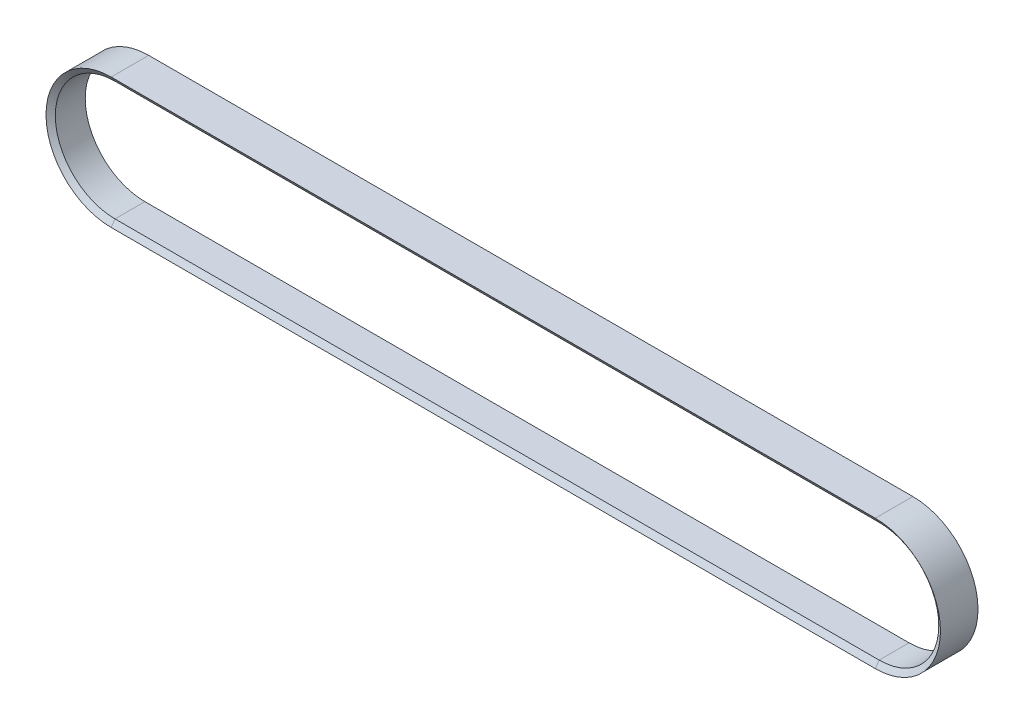
ISO-10303-21;
HEADER;
FILE_DESCRIPTION(('STEP AP214'),'2;1');
FILE_NAME('part.step','',(''),(''),'','','');
FILE_SCHEMA(('AUTOMOTIVE_DESIGN { 1 0 10303 214 1 1 1 1 }'));
ENDSEC;
DATA;
#1=APPLICATION_CONTEXT('core data for automotive mechanical design processes');
#2=APPLICATION_PROTOCOL_DEFINITION('international standard','automotive_design',2000,#1);
#3=PRODUCT_CONTEXT('',#1,'mechanical');
#4=PRODUCT('Part','Part','',(#3));
#5=PRODUCT_RELATED_PRODUCT_CATEGORY('part','',(#4));
#6=PRODUCT_DEFINITION_FORMATION('','',#4);
#7=PRODUCT_DEFINITION_CONTEXT('part definition',#1,'design');
#8=PRODUCT_DEFINITION('design','',#6,#7);
#9=PRODUCT_DEFINITION_SHAPE('','',#8);
#10=(LENGTH_UNIT() NAMED_UNIT(*) SI_UNIT(.MILLI.,.METRE.));
#11=(NAMED_UNIT(*) PLANE_ANGLE_UNIT() SI_UNIT($,.RADIAN.));
#12=(NAMED_UNIT(*) SI_UNIT($,.STERADIAN.) SOLID_ANGLE_UNIT());
#13=UNCERTAINTY_MEASURE_WITH_UNIT(LENGTH_MEASURE(1.E-05),#10,'distance_accuracy_value','');
#14=(GEOMETRIC_REPRESENTATION_CONTEXT(3) GLOBAL_UNCERTAINTY_ASSIGNED_CONTEXT((#13)) GLOBAL_UNIT_ASSIGNED_CONTEXT((#10,
#11,#12)) REPRESENTATION_CONTEXT('',''));
#15=CARTESIAN_POINT('',(0.,0.,0.));
#16=DIRECTION('',(0.,0.,1.));
#17=DIRECTION('',(1.,0.,0.));
#18=AXIS2_PLACEMENT_3D('',#15,#16,#17);
#19=CARTESIAN_POINT('',(0.,0.,0.));
#20=DIRECTION('',(0.,0.,-1.));
#21=DIRECTION('',(-1.,0.,0.));
#22=AXIS2_PLACEMENT_3D('',#19,#20,#21);
#23=CYLINDRICAL_SURFACE('',#22,54.);
#24=CARTESIAN_POINT('',(0.,0.,13.535));
#25=DIRECTION('',(0.,0.,-1.));
#26=DIRECTION('',(0.,-1.,0.));
#27=AXIS2_PLACEMENT_3D('',#24,#25,#26);
#28=CIRCLE('',#27,54.);
#29=CARTESIAN_POINT('',(0.,-54.,13.535));
#30=VERTEX_POINT('',#29);
#31=CARTESIAN_POINT('',(0.,54.,13.535));
#32=VERTEX_POINT('',#31);
#33=EDGE_CURVE('E11',#30,#32,#28,.T.);
#34=ORIENTED_EDGE('',*,*,#33,.F.);
#35=DIRECTION('',(0.,0.,-1.));
#36=VECTOR('',#35,1.);
#37=CARTESIAN_POINT('',(0.,-54.,13.535));
#38=LINE('',#37,#36);
#39=CARTESIAN_POINT('',(0.,-54.,-13.535));
#40=VERTEX_POINT('',#39);
#41=EDGE_CURVE('E40',#30,#40,#38,.T.);
#42=ORIENTED_EDGE('',*,*,#41,.T.);
#43=CARTESIAN_POINT('',(0.,0.,-13.535));
#44=DIRECTION('',(0.,0.,-1.));
#45=DIRECTION('',(0.,-1.,0.));
#46=AXIS2_PLACEMENT_3D('',#43,#44,#45);
#47=CIRCLE('',#46,54.);
#48=CARTESIAN_POINT('',(0.,54.,-13.535));
#49=VERTEX_POINT('',#48);
#50=EDGE_CURVE('E125',#40,#49,#47,.T.);
#51=ORIENTED_EDGE('',*,*,#50,.T.);
#52=DIRECTION('',(0.,0.,-1.));
#53=VECTOR('',#52,1.);
#54=CARTESIAN_POINT('',(0.,54.,13.535));
#55=LINE('',#54,#53);
#56=EDGE_CURVE('E128',#32,#49,#55,.T.);
#57=ORIENTED_EDGE('',*,*,#56,.F.);
#58=EDGE_LOOP('',(#34,#42,#51,#57));
#59=FACE_BOUND('',#58,.T.);
#60=ADVANCED_FACE('F37',(#59),#23,.F.);
#61=CARTESIAN_POINT('',(0.,0.,17.));
#62=DIRECTION('',(0.,0.,1.));
#63=DIRECTION('',(1.,0.,0.));
#64=AXIS2_PLACEMENT_3D('',#61,#62,#63);
#65=CONICAL_SURFACE('',#64,59.,0.964783814806948);
#66=CARTESIAN_POINT('',(0.,0.,17.));
#67=DIRECTION('',(0.,0.,-1.));
#68=DIRECTION('',(0.,-1.,0.));
#69=AXIS2_PLACEMENT_3D('',#66,#67,#68);
#70=CIRCLE('',#69,59.);
#71=CARTESIAN_POINT('',(0.,-59.,17.));
#72=VERTEX_POINT('',#71);
#73=CARTESIAN_POINT('',(0.,59.,17.));
#74=VERTEX_POINT('',#73);
#75=EDGE_CURVE('E45',#72,#74,#70,.T.);
#76=ORIENTED_EDGE('',*,*,#75,.F.);
#77=DIRECTION('',(0.,0.821925797703744,-0.569594577808695));
#78=VECTOR('',#77,1.);
#79=CARTESIAN_POINT('',(0.,-54.,13.535));
#80=LINE('',#79,#78);
#81=EDGE_CURVE('E195',#72,#30,#80,.T.);
#82=ORIENTED_EDGE('',*,*,#81,.T.);
#83=ORIENTED_EDGE('',*,*,#33,.T.);
#84=DIRECTION('',(0.,-0.821925797703744,-0.569594577808695));
#85=VECTOR('',#84,1.);
#86=CARTESIAN_POINT('',(0.,54.,13.535));
#87=LINE('',#86,#85);
#88=EDGE_CURVE('E153',#74,#32,#87,.T.);
#89=ORIENTED_EDGE('',*,*,#88,.F.);
#90=EDGE_LOOP('',(#76,#82,#83,#89));
#91=FACE_BOUND('',#90,.T.);
#92=ADVANCED_FACE('F219',(#91),#65,.F.);
#93=CARTESIAN_POINT('',(0.,0.,0.));
#94=DIRECTION('',(0.,0.,-1.));
#95=DIRECTION('',(-1.,0.,0.));
#96=AXIS2_PLACEMENT_3D('',#93,#94,#95);
#97=CYLINDRICAL_SURFACE('',#96,59.);
#98=CARTESIAN_POINT('',(0.,0.,-17.));
#99=DIRECTION('',(0.,0.,-1.));
#100=DIRECTION('',(0.,-1.,0.));
#101=AXIS2_PLACEMENT_3D('',#98,#99,#100);
#102=CIRCLE('',#101,59.);
#103=CARTESIAN_POINT('',(0.,-59.,-17.));
#104=VERTEX_POINT('',#103);
#105=CARTESIAN_POINT('',(0.,59.,-17.));
#106=VERTEX_POINT('',#105);
#107=EDGE_CURVE('E134',#104,#106,#102,.T.);
#108=ORIENTED_EDGE('',*,*,#107,.F.);
#109=DIRECTION('',(0.,0.,1.));
#110=VECTOR('',#109,1.);
#111=CARTESIAN_POINT('',(0.,-59.,-17.));
#112=LINE('',#111,#110);
#113=EDGE_CURVE('E179',#104,#72,#112,.T.);
#114=ORIENTED_EDGE('',*,*,#113,.T.);
#115=ORIENTED_EDGE('',*,*,#75,.T.);
#116=DIRECTION('',(0.,0.,1.));
#117=VECTOR('',#116,1.);
#118=CARTESIAN_POINT('',(0.,59.,-17.));
#119=LINE('',#118,#117);
#120=EDGE_CURVE('E157',#106,#74,#119,.T.);
#121=ORIENTED_EDGE('',*,*,#120,.F.);
#122=EDGE_LOOP('',(#108,#114,#115,#121));
#123=FACE_BOUND('',#122,.T.);
#124=ADVANCED_FACE('F224',(#123),#97,.T.);
#125=CARTESIAN_POINT('',(692.,-54.,13.535));
#126=DIRECTION('',(0.,1.,0.));
#127=DIRECTION('',(-1.,0.,0.));
#128=AXIS2_PLACEMENT_3D('',#125,#126,#127);
#129=PLANE('',#128);
#130=ORIENTED_EDGE('',*,*,#41,.F.);
#131=DIRECTION('',(-1.,0.,0.));
#132=VECTOR('',#131,1.);
#133=CARTESIAN_POINT('',(692.,-54.,13.535));
#134=LINE('',#133,#132);
#135=CARTESIAN_POINT('',(692.,-54.,13.535));
#136=VERTEX_POINT('',#135);
#137=EDGE_CURVE('E81',#136,#30,#134,.T.);
#138=ORIENTED_EDGE('',*,*,#137,.F.);
#139=DIRECTION('',(0.,0.,-1.));
#140=VECTOR('',#139,1.);
#141=CARTESIAN_POINT('',(692.,-54.,13.535));
#142=LINE('',#141,#140);
#143=CARTESIAN_POINT('',(692.,-54.,-13.535));
#144=VERTEX_POINT('',#143);
#145=EDGE_CURVE('E182',#136,#144,#142,.T.);
#146=ORIENTED_EDGE('',*,*,#145,.T.);
#147=DIRECTION('',(-1.,0.,0.));
#148=VECTOR('',#147,1.);
#149=CARTESIAN_POINT('',(692.,-54.,-13.535));
#150=LINE('',#149,#148);
#151=EDGE_CURVE('E177',#144,#40,#150,.T.);
#152=ORIENTED_EDGE('',*,*,#151,.T.);
#153=EDGE_LOOP('',(#130,#138,#146,#152));
#154=FACE_BOUND('',#153,.T.);
#155=ADVANCED_FACE('F208',(#154),#129,.T.);
#156=CARTESIAN_POINT('',(692.,-54.,13.535));
#157=DIRECTION('',(0.,0.569594577808695,0.821925797703743));
#158=DIRECTION('',(0.,-0.821925797703743,0.569594577808695));
#159=AXIS2_PLACEMENT_3D('',#156,#157,#158);
#160=PLANE('',#159);
#161=ORIENTED_EDGE('',*,*,#137,.T.);
#162=ORIENTED_EDGE('',*,*,#81,.F.);
#163=DIRECTION('',(-1.,0.,0.));
#164=VECTOR('',#163,1.);
#165=CARTESIAN_POINT('',(692.,-59.,17.));
#166=LINE('',#165,#164);
#167=CARTESIAN_POINT('',(692.,-59.,17.));
#168=VERTEX_POINT('',#167);
#169=EDGE_CURVE('E90',#168,#72,#166,.T.);
#170=ORIENTED_EDGE('',*,*,#169,.F.);
#171=DIRECTION('',(0.,0.821925797703744,-0.569594577808695));
#172=VECTOR('',#171,1.);
#173=CARTESIAN_POINT('',(692.,-54.,13.535));
#174=LINE('',#173,#172);
#175=EDGE_CURVE('E191',#168,#136,#174,.T.);
#176=ORIENTED_EDGE('',*,*,#175,.T.);
#177=EDGE_LOOP('',(#161,#162,#170,#176));
#178=FACE_BOUND('',#177,.T.);
#179=ADVANCED_FACE('F218',(#178),#160,.T.);
#180=CARTESIAN_POINT('',(692.,-59.,-17.));
#181=DIRECTION('',(0.,-1.,0.));
#182=DIRECTION('',(1.,0.,0.));
#183=AXIS2_PLACEMENT_3D('',#180,#181,#182);
#184=PLANE('',#183);
#185=ORIENTED_EDGE('',*,*,#169,.T.);
#186=ORIENTED_EDGE('',*,*,#113,.F.);
#187=DIRECTION('',(-1.,0.,0.));
#188=VECTOR('',#187,1.);
#189=CARTESIAN_POINT('',(692.,-59.,-17.));
#190=LINE('',#189,#188);
#191=CARTESIAN_POINT('',(692.,-59.,-17.));
#192=VERTEX_POINT('',#191);
#193=EDGE_CURVE('E98',#192,#104,#190,.T.);
#194=ORIENTED_EDGE('',*,*,#193,.F.);
#195=DIRECTION('',(0.,0.,1.));
#196=VECTOR('',#195,1.);
#197=CARTESIAN_POINT('',(692.,-59.,-17.));
#198=LINE('',#197,#196);
#199=EDGE_CURVE('E171',#192,#168,#198,.T.);
#200=ORIENTED_EDGE('',*,*,#199,.T.);
#201=EDGE_LOOP('',(#185,#186,#194,#200));
#202=FACE_BOUND('',#201,.T.);
#203=ADVANCED_FACE('F225',(#202),#184,.T.);
#204=CARTESIAN_POINT('',(692.,-54.,-13.535));
#205=DIRECTION('',(0.,0.569594577808695,-0.821925797703743));
#206=DIRECTION('',(0.,0.821925797703743,0.569594577808695));
#207=AXIS2_PLACEMENT_3D('',#204,#205,#206);
#208=PLANE('',#207);
#209=ORIENTED_EDGE('',*,*,#193,.T.);
#210=DIRECTION('',(0.,-0.821925797703744,-0.569594577808695));
#211=VECTOR('',#210,1.);
#212=CARTESIAN_POINT('',(0.,-54.,-13.535));
#213=LINE('',#212,#211);
#214=EDGE_CURVE('E175',#40,#104,#213,.T.);
#215=ORIENTED_EDGE('',*,*,#214,.F.);
#216=ORIENTED_EDGE('',*,*,#151,.F.);
#217=DIRECTION('',(0.,-0.821925797703744,-0.569594577808695));
#218=VECTOR('',#217,1.);
#219=CARTESIAN_POINT('',(692.,-54.,-13.535));
#220=LINE('',#219,#218);
#221=EDGE_CURVE('E166',#144,#192,#220,.T.);
#222=ORIENTED_EDGE('',*,*,#221,.T.);
#223=EDGE_LOOP('',(#209,#215,#216,#222));
#224=FACE_BOUND('',#223,.T.);
#225=ADVANCED_FACE('F226',(#224),#208,.T.);
#226=CARTESIAN_POINT('',(692.,0.,0.));
#227=DIRECTION('',(0.,0.,-1.));
#228=DIRECTION('',(-1.,0.,0.));
#229=AXIS2_PLACEMENT_3D('',#226,#227,#228);
#230=CYLINDRICAL_SURFACE('',#229,54.);
#231=ORIENTED_EDGE('',*,*,#145,.F.);
#232=CARTESIAN_POINT('',(692.,0.,13.535));
#233=DIRECTION('',(0.,0.,-1.));
#234=DIRECTION('',(0.,1.,0.));
#235=AXIS2_PLACEMENT_3D('',#232,#233,#234);
#236=CIRCLE('',#235,54.);
#237=CARTESIAN_POINT('',(692.,54.,13.535));
#238=VERTEX_POINT('',#237);
#239=EDGE_CURVE('E201',#238,#136,#236,.T.);
#240=ORIENTED_EDGE('',*,*,#239,.F.);
#241=DIRECTION('',(0.,0.,-1.));
#242=VECTOR('',#241,1.);
#243=CARTESIAN_POINT('',(692.,54.,13.535));
#244=LINE('',#243,#242);
#245=CARTESIAN_POINT('',(692.,54.,-13.535));
#246=VERTEX_POINT('',#245);
#247=EDGE_CURVE('E174',#238,#246,#244,.T.);
#248=ORIENTED_EDGE('',*,*,#247,.T.);
#249=CARTESIAN_POINT('',(692.,0.,-13.535));
#250=DIRECTION('',(0.,0.,-1.));
#251=DIRECTION('',(0.,1.,0.));
#252=AXIS2_PLACEMENT_3D('',#249,#250,#251);
#253=CIRCLE('',#252,54.);
#254=EDGE_CURVE('E169',#246,#144,#253,.T.);
#255=ORIENTED_EDGE('',*,*,#254,.T.);
#256=EDGE_LOOP('',(#231,#240,#248,#255));
#257=FACE_BOUND('',#256,.T.);
#258=ADVANCED_FACE('F213',(#257),#230,.F.);
#259=CARTESIAN_POINT('',(692.,0.,17.));
#260=DIRECTION('',(0.,0.,1.));
#261=DIRECTION('',(1.,0.,0.));
#262=AXIS2_PLACEMENT_3D('',#259,#260,#261);
#263=CONICAL_SURFACE('',#262,59.,0.964783814806948);
#264=ORIENTED_EDGE('',*,*,#239,.T.);
#265=ORIENTED_EDGE('',*,*,#175,.F.);
#266=CARTESIAN_POINT('',(692.,0.,17.));
#267=DIRECTION('',(0.,0.,-1.));
#268=DIRECTION('',(0.,1.,0.));
#269=AXIS2_PLACEMENT_3D('',#266,#267,#268);
#270=CIRCLE('',#269,59.);
#271=CARTESIAN_POINT('',(692.,59.,17.));
#272=VERTEX_POINT('',#271);
#273=EDGE_CURVE('E110',#272,#168,#270,.T.);
#274=ORIENTED_EDGE('',*,*,#273,.F.);
#275=DIRECTION('',(0.,-0.821925797703744,-0.569594577808695));
#276=VECTOR('',#275,1.);
#277=CARTESIAN_POINT('',(692.,54.,13.535));
#278=LINE('',#277,#276);
#279=EDGE_CURVE('E188',#272,#238,#278,.T.);
#280=ORIENTED_EDGE('',*,*,#279,.T.);
#281=EDGE_LOOP('',(#264,#265,#274,#280));
#282=FACE_BOUND('',#281,.T.);
#283=ADVANCED_FACE('F217',(#282),#263,.F.);
#284=CARTESIAN_POINT('',(692.,0.,0.));
#285=DIRECTION('',(0.,0.,-1.));
#286=DIRECTION('',(-1.,0.,0.));
#287=AXIS2_PLACEMENT_3D('',#284,#285,#286);
#288=CYLINDRICAL_SURFACE('',#287,59.);
#289=ORIENTED_EDGE('',*,*,#273,.T.);
#290=ORIENTED_EDGE('',*,*,#199,.F.);
#291=CARTESIAN_POINT('',(692.,0.,-17.));
#292=DIRECTION('',(0.,0.,-1.));
#293=DIRECTION('',(0.,1.,0.));
#294=AXIS2_PLACEMENT_3D('',#291,#292,#293);
#295=CIRCLE('',#294,59.);
#296=CARTESIAN_POINT('',(692.,59.,-17.));
#297=VERTEX_POINT('',#296);
#298=EDGE_CURVE('E116',#297,#192,#295,.T.);
#299=ORIENTED_EDGE('',*,*,#298,.F.);
#300=DIRECTION('',(0.,0.,1.));
#301=VECTOR('',#300,1.);
#302=CARTESIAN_POINT('',(692.,59.,-17.));
#303=LINE('',#302,#301);
#304=EDGE_CURVE('E164',#297,#272,#303,.T.);
#305=ORIENTED_EDGE('',*,*,#304,.T.);
#306=EDGE_LOOP('',(#289,#290,#299,#305));
#307=FACE_BOUND('',#306,.T.);
#308=ADVANCED_FACE('F279',(#307),#288,.T.);
#309=CARTESIAN_POINT('',(692.,0.,-13.535));
#310=DIRECTION('',(0.,0.,-1.));
#311=DIRECTION('',(-1.,0.,0.));
#312=AXIS2_PLACEMENT_3D('',#309,#310,#311);
#313=CONICAL_SURFACE('',#312,54.,0.964783814806948);
#314=ORIENTED_EDGE('',*,*,#298,.T.);
#315=ORIENTED_EDGE('',*,*,#221,.F.);
#316=ORIENTED_EDGE('',*,*,#254,.F.);
#317=DIRECTION('',(0.,0.821925797703744,-0.569594577808695));
#318=VECTOR('',#317,1.);
#319=CARTESIAN_POINT('',(692.,54.,-13.535));
#320=LINE('',#319,#318);
#321=EDGE_CURVE('E145',#246,#297,#320,.T.);
#322=ORIENTED_EDGE('',*,*,#321,.T.);
#323=EDGE_LOOP('',(#314,#315,#316,#322));
#324=FACE_BOUND('',#323,.T.);
#325=ADVANCED_FACE('F211',(#324),#313,.F.);
#326=CARTESIAN_POINT('',(0.,54.,13.535));
#327=DIRECTION('',(0.,-1.,0.));
#328=DIRECTION('',(1.,0.,0.));
#329=AXIS2_PLACEMENT_3D('',#326,#327,#328);
#330=PLANE('',#329);
#331=ORIENTED_EDGE('',*,*,#247,.F.);
#332=DIRECTION('',(1.,0.,0.));
#333=VECTOR('',#332,1.);
#334=CARTESIAN_POINT('',(0.,54.,13.535));
#335=LINE('',#334,#333);
#336=EDGE_CURVE('E152',#32,#238,#335,.T.);
#337=ORIENTED_EDGE('',*,*,#336,.F.);
#338=ORIENTED_EDGE('',*,*,#56,.T.);
#339=DIRECTION('',(1.,0.,0.));
#340=VECTOR('',#339,1.);
#341=CARTESIAN_POINT('',(0.,54.,-13.535));
#342=LINE('',#341,#340);
#343=EDGE_CURVE('E140',#49,#246,#342,.T.);
#344=ORIENTED_EDGE('',*,*,#343,.T.);
#345=EDGE_LOOP('',(#331,#337,#338,#344));
#346=FACE_BOUND('',#345,.T.);
#347=ADVANCED_FACE('F150',(#346),#330,.T.);
#348=CARTESIAN_POINT('',(0.,54.,13.535));
#349=DIRECTION('',(0.,-0.569594577808695,0.821925797703743));
#350=DIRECTION('',(0.,-0.821925797703743,-0.569594577808695));
#351=AXIS2_PLACEMENT_3D('',#348,#349,#350);
#352=PLANE('',#351);
#353=ORIENTED_EDGE('',*,*,#336,.T.);
#354=ORIENTED_EDGE('',*,*,#279,.F.);
#355=DIRECTION('',(1.,0.,0.));
#356=VECTOR('',#355,1.);
#357=CARTESIAN_POINT('',(0.,59.,17.));
#358=LINE('',#357,#356);
#359=EDGE_CURVE('E185',#74,#272,#358,.T.);
#360=ORIENTED_EDGE('',*,*,#359,.F.);
#361=ORIENTED_EDGE('',*,*,#88,.T.);
#362=EDGE_LOOP('',(#353,#354,#360,#361));
#363=FACE_BOUND('',#362,.T.);
#364=ADVANCED_FACE('F215',(#363),#352,.T.);
#365=CARTESIAN_POINT('',(0.,59.,-17.));
#366=DIRECTION('',(0.,1.,0.));
#367=DIRECTION('',(-1.,0.,0.));
#368=AXIS2_PLACEMENT_3D('',#365,#366,#367);
#369=PLANE('',#368);
#370=ORIENTED_EDGE('',*,*,#359,.T.);
#371=ORIENTED_EDGE('',*,*,#304,.F.);
#372=DIRECTION('',(1.,0.,0.));
#373=VECTOR('',#372,1.);
#374=CARTESIAN_POINT('',(0.,59.,-17.));
#375=LINE('',#374,#373);
#376=EDGE_CURVE('E163',#106,#297,#375,.T.);
#377=ORIENTED_EDGE('',*,*,#376,.F.);
#378=ORIENTED_EDGE('',*,*,#120,.T.);
#379=EDGE_LOOP('',(#370,#371,#377,#378));
#380=FACE_BOUND('',#379,.T.);
#381=ADVANCED_FACE('F222',(#380),#369,.T.);
#382=CARTESIAN_POINT('',(0.,54.,-13.535));
#383=DIRECTION('',(0.,-0.569594577808695,-0.821925797703743));
#384=DIRECTION('',(0.,0.821925797703743,-0.569594577808695));
#385=AXIS2_PLACEMENT_3D('',#382,#383,#384);
#386=PLANE('',#385);
#387=ORIENTED_EDGE('',*,*,#376,.T.);
#388=ORIENTED_EDGE('',*,*,#321,.F.);
#389=ORIENTED_EDGE('',*,*,#343,.F.);
#390=DIRECTION('',(0.,0.821925797703744,-0.569594577808695));
#391=VECTOR('',#390,1.);
#392=CARTESIAN_POINT('',(0.,54.,-13.535));
#393=LINE('',#392,#391);
#394=EDGE_CURVE('E143',#49,#106,#393,.T.);
#395=ORIENTED_EDGE('',*,*,#394,.T.);
#396=EDGE_LOOP('',(#387,#388,#389,#395));
#397=FACE_BOUND('',#396,.T.);
#398=ADVANCED_FACE('F142',(#397),#386,.T.);
#399=CARTESIAN_POINT('',(0.,0.,-13.535));
#400=DIRECTION('',(0.,0.,-1.));
#401=DIRECTION('',(-1.,0.,0.));
#402=AXIS2_PLACEMENT_3D('',#399,#400,#401);
#403=CONICAL_SURFACE('',#402,54.,0.964783814806948);
#404=ORIENTED_EDGE('',*,*,#214,.T.);
#405=ORIENTED_EDGE('',*,*,#107,.T.);
#406=ORIENTED_EDGE('',*,*,#394,.F.);
#407=ORIENTED_EDGE('',*,*,#50,.F.);
#408=EDGE_LOOP('',(#404,#405,#406,#407));
#409=FACE_BOUND('',#408,.T.);
#410=ADVANCED_FACE('F155',(#409),#403,.F.);
#411=CLOSED_SHELL('',(#60,#92,#124,#155,#179,#203,#225,#258,#283,#308,#325,#347,#364,#381,#398,#410));
#412=MANIFOLD_SOLID_BREP('B2',#411);
#413=ADVANCED_BREP_SHAPE_REPRESENTATION('',(#18,#412),#14);
#414=SHAPE_DEFINITION_REPRESENTATION(#9,#413);
ENDSEC;
END-ISO-10303-21;
